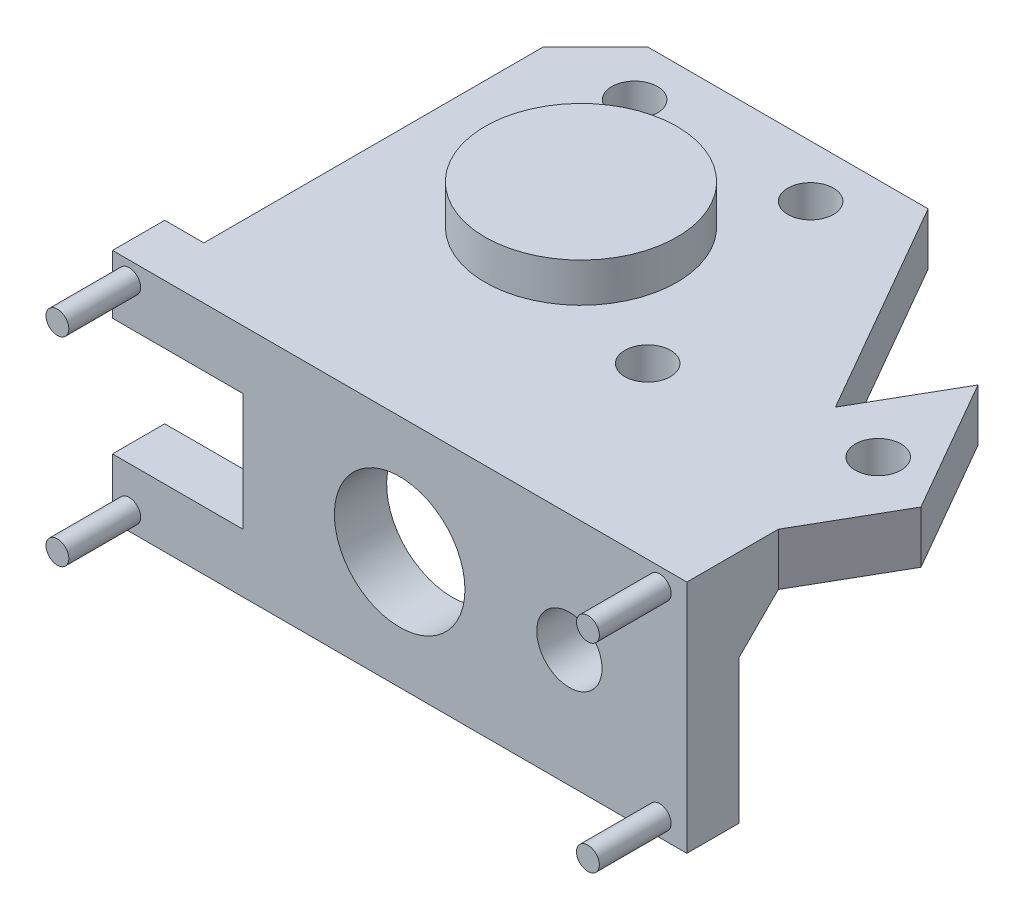
ISO-10303-21;
HEADER;
FILE_DESCRIPTION(('STEP AP214'),'2;1');
FILE_NAME('part.step','',(''),(''),'','','');
FILE_SCHEMA(('AUTOMOTIVE_DESIGN { 1 0 10303 214 1 1 1 1 }'));
ENDSEC;
DATA;
#1=APPLICATION_CONTEXT('core data for automotive mechanical design processes');
#2=APPLICATION_PROTOCOL_DEFINITION('international standard','automotive_design',2000,#1);
#3=PRODUCT_CONTEXT('',#1,'mechanical');
#4=PRODUCT('Part','Part','',(#3));
#5=PRODUCT_RELATED_PRODUCT_CATEGORY('part','',(#4));
#6=PRODUCT_DEFINITION_FORMATION('','',#4);
#7=PRODUCT_DEFINITION_CONTEXT('part definition',#1,'design');
#8=PRODUCT_DEFINITION('design','',#6,#7);
#9=PRODUCT_DEFINITION_SHAPE('','',#8);
#10=(LENGTH_UNIT() NAMED_UNIT(*) SI_UNIT(.MILLI.,.METRE.));
#11=(NAMED_UNIT(*) PLANE_ANGLE_UNIT() SI_UNIT($,.RADIAN.));
#12=(NAMED_UNIT(*) SI_UNIT($,.STERADIAN.) SOLID_ANGLE_UNIT());
#13=UNCERTAINTY_MEASURE_WITH_UNIT(LENGTH_MEASURE(1.E-05),#10,'distance_accuracy_value','');
#14=(GEOMETRIC_REPRESENTATION_CONTEXT(3) GLOBAL_UNCERTAINTY_ASSIGNED_CONTEXT((#13)) GLOBAL_UNIT_ASSIGNED_CONTEXT((#10,
#11,#12)) REPRESENTATION_CONTEXT('',''));
#15=CARTESIAN_POINT('',(0.,0.,0.));
#16=DIRECTION('',(0.,0.,1.));
#17=DIRECTION('',(1.,0.,0.));
#18=AXIS2_PLACEMENT_3D('',#15,#16,#17);
#19=CARTESIAN_POINT('',(0.,0.,0.));
#20=DIRECTION('',(0.,0.,1.));
#21=DIRECTION('',(1.,0.,0.));
#22=AXIS2_PLACEMENT_3D('',#19,#20,#21);
#23=PLANE('',#22);
#24=DIRECTION('',(0.,-1.,0.));
#25=VECTOR('',#24,1.);
#26=CARTESIAN_POINT('',(-19.,0.,0.));
#27=LINE('',#26,#25);
#28=CARTESIAN_POINT('',(-19.,9.,0.));
#29=VERTEX_POINT('',#28);
#30=CARTESIAN_POINT('',(-19.,4.5,0.));
#31=VERTEX_POINT('',#30);
#32=EDGE_CURVE('E235',#29,#31,#27,.T.);
#33=ORIENTED_EDGE('',*,*,#32,.T.);
#34=DIRECTION('',(1.,0.,0.));
#35=VECTOR('',#34,1.);
#36=CARTESIAN_POINT('',(0.,4.5,0.));
#37=LINE('',#36,#35);
#38=CARTESIAN_POINT('',(-22.,4.5,0.));
#39=VERTEX_POINT('',#38);
#40=EDGE_CURVE('E269',#39,#31,#37,.T.);
#41=ORIENTED_EDGE('',*,*,#40,.F.);
#42=DIRECTION('',(0.,-1.,0.));
#43=VECTOR('',#42,1.);
#44=CARTESIAN_POINT('',(-22.,9.,0.));
#45=LINE('',#44,#43);
#46=CARTESIAN_POINT('',(-22.,9.,0.));
#47=VERTEX_POINT('',#46);
#48=EDGE_CURVE('E336',#47,#39,#45,.T.);
#49=ORIENTED_EDGE('',*,*,#48,.F.);
#50=DIRECTION('',(-1.,0.,0.));
#51=VECTOR('',#50,1.);
#52=CARTESIAN_POINT('',(-22.,9.,0.));
#53=LINE('',#52,#51);
#54=EDGE_CURVE('E316',#29,#47,#53,.T.);
#55=ORIENTED_EDGE('',*,*,#54,.F.);
#56=EDGE_LOOP('',(#33,#41,#49,#55));
#57=FACE_BOUND('',#56,.T.);
#58=ADVANCED_FACE('F37',(#57),#23,.F.);
#59=CARTESIAN_POINT('',(17.8339229478491,12.,-10.2550012653063));
#60=DIRECTION('',(0.866895893185841,0.,-0.498489227945322));
#61=DIRECTION('',(-0.498489227945322,0.,-0.866895893185841));
#62=AXIS2_PLACEMENT_3D('',#59,#60,#61);
#63=PLANE('',#62);
#64=DIRECTION('',(0.498489227945322,0.,0.866895893185841));
#65=VECTOR('',#64,1.);
#66=CARTESIAN_POINT('',(14.0956627775563,9.,-16.7560091258864));
#67=LINE('',#66,#65);
#68=CARTESIAN_POINT('',(6.48,9.,-30.));
#69=VERTEX_POINT('',#68);
#70=CARTESIAN_POINT('',(16.0879177565685,9.,-13.2913852931841));
#71=VERTEX_POINT('',#70);
#72=EDGE_CURVE('E413',#69,#71,#67,.T.);
#73=ORIENTED_EDGE('',*,*,#72,.T.);
#74=DIRECTION('',(0.,-1.,0.));
#75=VECTOR('',#74,1.);
#76=CARTESIAN_POINT('',(16.0879177565685,9.,-13.2913852931841));
#77=LINE('',#76,#75);
#78=CARTESIAN_POINT('',(16.0879177565685,5.,-13.2913852931841));
#79=VERTEX_POINT('',#78);
#80=EDGE_CURVE('E390',#71,#79,#77,.T.);
#81=ORIENTED_EDGE('',*,*,#80,.T.);
#82=DIRECTION('',(0.498489227945322,0.,0.866895893185841));
#83=VECTOR('',#82,1.);
#84=CARTESIAN_POINT('',(17.8339229478491,5.,-10.2550012653063));
#85=LINE('',#84,#83);
#86=CARTESIAN_POINT('',(6.48,5.,-30.));
#87=VERTEX_POINT('',#86);
#88=EDGE_CURVE('E394',#87,#79,#85,.T.);
#89=ORIENTED_EDGE('',*,*,#88,.F.);
#90=DIRECTION('',(0.,-1.,0.));
#91=VECTOR('',#90,1.);
#92=CARTESIAN_POINT('',(6.47999999999999,0.,-30.));
#93=LINE('',#92,#91);
#94=EDGE_CURVE('E381',#69,#87,#93,.T.);
#95=ORIENTED_EDGE('',*,*,#94,.F.);
#96=EDGE_LOOP('',(#73,#81,#89,#95));
#97=FACE_BOUND('',#96,.T.);
#98=ADVANCED_FACE('F455',(#97),#63,.T.);
#99=CARTESIAN_POINT('',(22.,9.,4.));
#100=DIRECTION('',(-1.,0.,0.));
#101=DIRECTION('',(0.,0.,1.));
#102=AXIS2_PLACEMENT_3D('',#99,#100,#101);
#103=PLANE('',#102);
#104=DIRECTION('',(0.,-1.,0.));
#105=VECTOR('',#104,1.);
#106=CARTESIAN_POINT('',(22.,12.,-3.01));
#107=LINE('',#106,#105);
#108=CARTESIAN_POINT('',(22.,9.,-3.01));
#109=VERTEX_POINT('',#108);
#110=CARTESIAN_POINT('',(22.,5.,-3.01));
#111=VERTEX_POINT('',#110);
#112=EDGE_CURVE('E408',#109,#111,#107,.T.);
#113=ORIENTED_EDGE('',*,*,#112,.F.);
#114=DIRECTION('',(0.,0.,-1.));
#115=VECTOR('',#114,1.);
#116=CARTESIAN_POINT('',(22.,9.,4.));
#117=LINE('',#116,#115);
#118=CARTESIAN_POINT('',(22.,9.,4.));
#119=VERTEX_POINT('',#118);
#120=EDGE_CURVE('E325',#119,#109,#117,.T.);
#121=ORIENTED_EDGE('',*,*,#120,.F.);
#122=DIRECTION('',(0.,1.,0.));
#123=VECTOR('',#122,1.);
#124=CARTESIAN_POINT('',(22.,9.,4.));
#125=LINE('',#124,#123);
#126=CARTESIAN_POINT('',(22.,-9.,4.));
#127=VERTEX_POINT('',#126);
#128=EDGE_CURVE('E298',#127,#119,#125,.T.);
#129=ORIENTED_EDGE('',*,*,#128,.F.);
#130=DIRECTION('',(0.,0.,-1.));
#131=VECTOR('',#130,1.);
#132=CARTESIAN_POINT('',(22.,-9.,4.));
#133=LINE('',#132,#131);
#134=CARTESIAN_POINT('',(22.,-9.,0.));
#135=VERTEX_POINT('',#134);
#136=EDGE_CURVE('E310',#127,#135,#133,.T.);
#137=ORIENTED_EDGE('',*,*,#136,.T.);
#138=DIRECTION('',(0.,1.,0.));
#139=VECTOR('',#138,1.);
#140=CARTESIAN_POINT('',(22.,9.,0.));
#141=LINE('',#140,#139);
#142=CARTESIAN_POINT('',(22.,2.00000000000001,0.));
#143=VERTEX_POINT('',#142);
#144=EDGE_CURVE('E296',#135,#143,#141,.T.);
#145=ORIENTED_EDGE('',*,*,#144,.T.);
#146=DIRECTION('',(0.,-0.707106781186544,0.707106781186551));
#147=VECTOR('',#146,1.);
#148=CARTESIAN_POINT('',(22.,3.49999999999997,-1.49999999999998));
#149=LINE('',#148,#147);
#150=CARTESIAN_POINT('',(22.,5.,-3.00000000000002));
#151=VERTEX_POINT('',#150);
#152=EDGE_CURVE('E199',#143,#151,#149,.F.);
#153=ORIENTED_EDGE('',*,*,#152,.T.);
#154=DIRECTION('',(0.,0.,1.));
#155=VECTOR('',#154,1.);
#156=CARTESIAN_POINT('',(22.,5.,-30.));
#157=LINE('',#156,#155);
#158=EDGE_CURVE('E247',#111,#151,#157,.T.);
#159=ORIENTED_EDGE('',*,*,#158,.F.);
#160=EDGE_LOOP('',(#113,#121,#129,#137,#145,#153,#159));
#161=FACE_BOUND('',#160,.T.);
#162=ADVANCED_FACE('F353',(#161),#103,.F.);
#163=CARTESIAN_POINT('',(-22.,9.,4.));
#164=DIRECTION('',(0.,-1.,0.));
#165=DIRECTION('',(0.,0.,-1.));
#166=AXIS2_PLACEMENT_3D('',#163,#164,#165);
#167=PLANE('',#166);
#168=CARTESIAN_POINT('',(-12.,9.,-26.));
#169=DIRECTION('',(0.,-1.,0.));
#170=DIRECTION('',(0.,0.,-1.));
#171=AXIS2_PLACEMENT_3D('',#168,#169,#170);
#172=CIRCLE('',#171,1.75);
#173=CARTESIAN_POINT('',(-12.,9.,-27.75));
#174=VERTEX_POINT('',#173);
#175=EDGE_CURVE('E838',#174,#174,#172,.T.);
#176=ORIENTED_EDGE('',*,*,#175,.T.);
#177=EDGE_LOOP('',(#176));
#178=FACE_BOUND('',#177,.T.);
#179=CARTESIAN_POINT('',(1.48,9.,-26.));
#180=DIRECTION('',(0.,-1.,0.));
#181=DIRECTION('',(0.,0.,-1.));
#182=AXIS2_PLACEMENT_3D('',#179,#180,#181);
#183=CIRCLE('',#182,1.75);
#184=CARTESIAN_POINT('',(1.48,9.,-27.75));
#185=VERTEX_POINT('',#184);
#186=EDGE_CURVE('E842',#185,#185,#183,.T.);
#187=ORIENTED_EDGE('',*,*,#186,.T.);
#188=EDGE_LOOP('',(#187));
#189=FACE_BOUND('',#188,.T.);
#190=CARTESIAN_POINT('',(21.0379157900655,9.,-11.6182762193354));
#191=DIRECTION('',(0.,-1.,0.));
#192=DIRECTION('',(0.,0.,-1.));
#193=AXIS2_PLACEMENT_3D('',#190,#191,#192);
#194=CIRCLE('',#193,1.75);
#195=CARTESIAN_POINT('',(21.0379157900655,9.,-13.3682762193354));
#196=VERTEX_POINT('',#195);
#197=EDGE_CURVE('E428',#196,#196,#194,.T.);
#198=ORIENTED_EDGE('',*,*,#197,.T.);
#199=EDGE_LOOP('',(#198));
#200=FACE_BOUND('',#199,.T.);
#201=CARTESIAN_POINT('',(6.,9.,-9.));
#202=DIRECTION('',(0.,-1.,0.));
#203=DIRECTION('',(0.,0.,-1.));
#204=AXIS2_PLACEMENT_3D('',#201,#202,#203);
#205=CIRCLE('',#204,1.75);
#206=CARTESIAN_POINT('',(6.,9.,-10.75));
#207=VERTEX_POINT('',#206);
#208=EDGE_CURVE('E417',#207,#207,#205,.T.);
#209=ORIENTED_EDGE('',*,*,#208,.T.);
#210=EDGE_LOOP('',(#209));
#211=FACE_BOUND('',#210,.T.);
#212=CARTESIAN_POINT('',(-5.61,9.,-15.5));
#213=DIRECTION('',(0.,-1.,0.));
#214=DIRECTION('',(0.,0.,-1.));
#215=AXIS2_PLACEMENT_3D('',#212,#213,#214);
#216=CIRCLE('',#215,7.35);
#217=CARTESIAN_POINT('',(-5.61,9.,-22.85));
#218=VERTEX_POINT('',#217);
#219=EDGE_CURVE('E240',#218,#218,#216,.F.);
#220=ORIENTED_EDGE('',*,*,#219,.F.);
#221=EDGE_LOOP('',(#220));
#222=FACE_BOUND('',#221,.T.);
#223=DIRECTION('',(1.,0.,0.));
#224=VECTOR('',#223,1.);
#225=CARTESIAN_POINT('',(0.,9.,-30.));
#226=LINE('',#225,#224);
#227=CARTESIAN_POINT('',(-15.,9.,-30.));
#228=VERTEX_POINT('',#227);
#229=EDGE_CURVE('E228',#228,#69,#226,.T.);
#230=ORIENTED_EDGE('',*,*,#229,.F.);
#231=DIRECTION('',(0.707106781186549,0.,-0.707106781186546));
#232=VECTOR('',#231,1.);
#233=CARTESIAN_POINT('',(-19.,9.,-26.));
#234=LINE('',#233,#232);
#235=CARTESIAN_POINT('',(-19.,9.,-26.));
#236=VERTEX_POINT('',#235);
#237=EDGE_CURVE('E11',#228,#236,#234,.F.);
#238=ORIENTED_EDGE('',*,*,#237,.T.);
#239=DIRECTION('',(0.,0.,1.));
#240=VECTOR('',#239,1.);
#241=CARTESIAN_POINT('',(-19.,9.,-30.));
#242=LINE('',#241,#240);
#243=EDGE_CURVE('E224',#236,#29,#242,.T.);
#244=ORIENTED_EDGE('',*,*,#243,.T.);
#245=ORIENTED_EDGE('',*,*,#54,.T.);
#246=DIRECTION('',(0.,0.,-1.));
#247=VECTOR('',#246,1.);
#248=CARTESIAN_POINT('',(-22.,9.,4.));
#249=LINE('',#248,#247);
#250=CARTESIAN_POINT('',(-22.,9.,4.));
#251=VERTEX_POINT('',#250);
#252=EDGE_CURVE('E328',#251,#47,#249,.T.);
#253=ORIENTED_EDGE('',*,*,#252,.F.);
#254=DIRECTION('',(-1.,0.,0.));
#255=VECTOR('',#254,1.);
#256=CARTESIAN_POINT('',(-22.,9.,4.));
#257=LINE('',#256,#255);
#258=EDGE_CURVE('E301',#119,#251,#257,.T.);
#259=ORIENTED_EDGE('',*,*,#258,.F.);
#260=ORIENTED_EDGE('',*,*,#120,.T.);
#261=DIRECTION('',(0.498489227945323,0.,-0.866895893185841));
#262=VECTOR('',#261,1.);
#263=CARTESIAN_POINT('',(15.2324505955399,9.,8.75908237283362));
#264=LINE('',#263,#262);
#265=CARTESIAN_POINT('',(25.9879138235626,9.,-9.94516714548672));
#266=VERTEX_POINT('',#265);
#267=EDGE_CURVE('E405',#109,#266,#264,.T.);
#268=ORIENTED_EDGE('',*,*,#267,.T.);
#269=DIRECTION('',(0.498489227945322,0.,0.866895893185841));
#270=VECTOR('',#269,1.);
#271=CARTESIAN_POINT('',(23.8278251364293,9.,-13.7016615827115));
#272=LINE('',#271,#270);
#273=CARTESIAN_POINT('',(20.0758315801311,9.,-20.2265524386708));
#274=VERTEX_POINT('',#273);
#275=EDGE_CURVE('E388',#274,#266,#272,.T.);
#276=ORIENTED_EDGE('',*,*,#275,.F.);
#277=DIRECTION('',(-0.498489227945322,0.,0.866895893185841));
#278=VECTOR('',#277,1.);
#279=CARTESIAN_POINT('',(6.34649060096974,9.,3.64940845228049));
#280=LINE('',#279,#278);
#281=EDGE_CURVE('E386',#274,#71,#280,.T.);
#282=ORIENTED_EDGE('',*,*,#281,.T.);
#283=ORIENTED_EDGE('',*,*,#72,.F.);
#284=EDGE_LOOP('',(#230,#238,#244,#245,#253,#259,#260,#268,#276,#282,#283));
#285=FACE_BOUND('',#284,.T.);
#286=ADVANCED_FACE('F437',(#178,#189,#200,#211,#222,#285),#167,.F.);
#287=CARTESIAN_POINT('',(0.,5.,-30.));
#288=DIRECTION('',(0.,1.,0.));
#289=DIRECTION('',(0.,0.,1.));
#290=AXIS2_PLACEMENT_3D('',#287,#288,#289);
#291=PLANE('',#290);
#292=CARTESIAN_POINT('',(-12.,5.,-26.));
#293=DIRECTION('',(0.,-1.,0.));
#294=DIRECTION('',(0.,0.,-1.));
#295=AXIS2_PLACEMENT_3D('',#292,#293,#294);
#296=CIRCLE('',#295,1.75);
#297=CARTESIAN_POINT('',(-12.,5.,-27.75));
#298=VERTEX_POINT('',#297);
#299=EDGE_CURVE('E193',#298,#298,#296,.T.);
#300=ORIENTED_EDGE('',*,*,#299,.F.);
#301=EDGE_LOOP('',(#300));
#302=FACE_BOUND('',#301,.T.);
#303=CARTESIAN_POINT('',(1.48,5.,-26.));
#304=DIRECTION('',(0.,-1.,0.));
#305=DIRECTION('',(0.,0.,-1.));
#306=AXIS2_PLACEMENT_3D('',#303,#304,#305);
#307=CIRCLE('',#306,1.75);
#308=CARTESIAN_POINT('',(1.48,5.,-27.75));
#309=VERTEX_POINT('',#308);
#310=EDGE_CURVE('E839',#309,#309,#307,.T.);
#311=ORIENTED_EDGE('',*,*,#310,.F.);
#312=EDGE_LOOP('',(#311));
#313=FACE_BOUND('',#312,.T.);
#314=CARTESIAN_POINT('',(21.0379157900655,5.,-11.6182762193354));
#315=DIRECTION('',(0.,-1.,0.));
#316=DIRECTION('',(0.,0.,-1.));
#317=AXIS2_PLACEMENT_3D('',#314,#315,#316);
#318=CIRCLE('',#317,1.75);
#319=CARTESIAN_POINT('',(21.0379157900655,5.,-13.3682762193354));
#320=VERTEX_POINT('',#319);
#321=EDGE_CURVE('E848',#320,#320,#318,.T.);
#322=ORIENTED_EDGE('',*,*,#321,.F.);
#323=EDGE_LOOP('',(#322));
#324=FACE_BOUND('',#323,.T.);
#325=CARTESIAN_POINT('',(6.,5.,-9.));
#326=DIRECTION('',(0.,-1.,0.));
#327=DIRECTION('',(0.,0.,-1.));
#328=AXIS2_PLACEMENT_3D('',#325,#326,#327);
#329=CIRCLE('',#328,1.75);
#330=CARTESIAN_POINT('',(6.,5.,-10.75));
#331=VERTEX_POINT('',#330);
#332=EDGE_CURVE('E423',#331,#331,#329,.T.);
#333=ORIENTED_EDGE('',*,*,#332,.F.);
#334=EDGE_LOOP('',(#333));
#335=FACE_BOUND('',#334,.T.);
#336=DIRECTION('',(0.,0.,1.));
#337=VECTOR('',#336,1.);
#338=CARTESIAN_POINT('',(-19.,5.,-30.));
#339=LINE('',#338,#337);
#340=CARTESIAN_POINT('',(-19.,5.,-26.));
#341=VERTEX_POINT('',#340);
#342=CARTESIAN_POINT('',(-19.,5.,-3.00000000000002));
#343=VERTEX_POINT('',#342);
#344=EDGE_CURVE('E227',#341,#343,#339,.T.);
#345=ORIENTED_EDGE('',*,*,#344,.F.);
#346=DIRECTION('',(-0.707106781186549,0.,0.707106781186546));
#347=VECTOR('',#346,1.);
#348=CARTESIAN_POINT('',(-19.,5.,-26.));
#349=LINE('',#348,#347);
#350=CARTESIAN_POINT('',(-15.,5.,-30.));
#351=VERTEX_POINT('',#350);
#352=EDGE_CURVE('E59',#341,#351,#349,.F.);
#353=ORIENTED_EDGE('',*,*,#352,.T.);
#354=DIRECTION('',(-1.,0.,0.));
#355=VECTOR('',#354,1.);
#356=CARTESIAN_POINT('',(0.,5.,-30.));
#357=LINE('',#356,#355);
#358=EDGE_CURVE('E238',#87,#351,#357,.T.);
#359=ORIENTED_EDGE('',*,*,#358,.F.);
#360=ORIENTED_EDGE('',*,*,#88,.T.);
#361=DIRECTION('',(-0.498489227945322,0.,0.866895893185841));
#362=VECTOR('',#361,1.);
#363=CARTESIAN_POINT('',(6.34649060096974,5.,3.64940845228049));
#364=LINE('',#363,#362);
#365=CARTESIAN_POINT('',(20.0758315801311,5.,-20.2265524386708));
#366=VERTEX_POINT('',#365);
#367=EDGE_CURVE('E415',#366,#79,#364,.T.);
#368=ORIENTED_EDGE('',*,*,#367,.F.);
#369=DIRECTION('',(0.498489227945322,0.,0.866895893185841));
#370=VECTOR('',#369,1.);
#371=CARTESIAN_POINT('',(23.8278251364293,5.,-13.7016615827115));
#372=LINE('',#371,#370);
#373=CARTESIAN_POINT('',(25.9879138235626,5.,-9.94516714548672));
#374=VERTEX_POINT('',#373);
#375=EDGE_CURVE('E416',#366,#374,#372,.T.);
#376=ORIENTED_EDGE('',*,*,#375,.T.);
#377=DIRECTION('',(0.498489227945323,0.,-0.866895893185841));
#378=VECTOR('',#377,1.);
#379=CARTESIAN_POINT('',(15.2324505955399,5.,8.75908237283362));
#380=LINE('',#379,#378);
#381=EDGE_CURVE('E389',#111,#374,#380,.T.);
#382=ORIENTED_EDGE('',*,*,#381,.F.);
#383=ORIENTED_EDGE('',*,*,#158,.T.);
#384=DIRECTION('',(-1.,0.,0.));
#385=VECTOR('',#384,1.);
#386=CARTESIAN_POINT('',(0.,5.,-3.00000000000002));
#387=LINE('',#386,#385);
#388=CARTESIAN_POINT('',(0.,5.,-3.00000000000002));
#389=VERTEX_POINT('',#388);
#390=EDGE_CURVE('E204',#151,#389,#387,.T.);
#391=ORIENTED_EDGE('',*,*,#390,.T.);
#392=DIRECTION('',(-1.,0.,0.));
#393=VECTOR('',#392,1.);
#394=CARTESIAN_POINT('',(-19.,5.,-3.00000000000002));
#395=LINE('',#394,#393);
#396=EDGE_CURVE('E200',#389,#343,#395,.T.);
#397=ORIENTED_EDGE('',*,*,#396,.T.);
#398=EDGE_LOOP('',(#345,#353,#359,#360,#368,#376,#382,#383,#391,#397));
#399=FACE_BOUND('',#398,.T.);
#400=ADVANCED_FACE('F454',(#302,#313,#324,#335,#399),#291,.F.);
#401=CARTESIAN_POINT('',(0.,0.,-30.));
#402=DIRECTION('',(0.,0.,-1.));
#403=DIRECTION('',(-1.,0.,0.));
#404=AXIS2_PLACEMENT_3D('',#401,#402,#403);
#405=PLANE('',#404);
#406=ORIENTED_EDGE('',*,*,#358,.T.);
#407=DIRECTION('',(0.,1.,0.));
#408=VECTOR('',#407,1.);
#409=CARTESIAN_POINT('',(-15.,0.,-30.));
#410=LINE('',#409,#408);
#411=EDGE_CURVE('E45',#351,#228,#410,.T.);
#412=ORIENTED_EDGE('',*,*,#411,.T.);
#413=ORIENTED_EDGE('',*,*,#229,.T.);
#414=ORIENTED_EDGE('',*,*,#94,.T.);
#415=EDGE_LOOP('',(#406,#412,#413,#414));
#416=FACE_BOUND('',#415,.T.);
#417=ADVANCED_FACE('F456',(#416),#405,.T.);
#418=CARTESIAN_POINT('',(-22.,9.,4.));
#419=DIRECTION('',(1.,0.,0.));
#420=DIRECTION('',(0.,0.,-1.));
#421=AXIS2_PLACEMENT_3D('',#418,#419,#420);
#422=PLANE('',#421);
#423=DIRECTION('',(0.,0.,1.));
#424=VECTOR('',#423,1.);
#425=CARTESIAN_POINT('',(-22.,4.5,0.));
#426=LINE('',#425,#424);
#427=CARTESIAN_POINT('',(-22.,4.5,4.));
#428=VERTEX_POINT('',#427);
#429=EDGE_CURVE('E289',#39,#428,#426,.T.);
#430=ORIENTED_EDGE('',*,*,#429,.T.);
#431=DIRECTION('',(0.,-1.,0.));
#432=VECTOR('',#431,1.);
#433=CARTESIAN_POINT('',(-22.,9.,4.));
#434=LINE('',#433,#432);
#435=EDGE_CURVE('E305',#251,#428,#434,.T.);
#436=ORIENTED_EDGE('',*,*,#435,.F.);
#437=ORIENTED_EDGE('',*,*,#252,.T.);
#438=ORIENTED_EDGE('',*,*,#48,.T.);
#439=EDGE_LOOP('',(#430,#436,#437,#438));
#440=FACE_BOUND('',#439,.T.);
#441=ADVANCED_FACE('F472',(#440),#422,.F.);
#442=CARTESIAN_POINT('',(0.,0.,4.));
#443=DIRECTION('',(0.,0.,1.));
#444=DIRECTION('',(1.,0.,0.));
#445=AXIS2_PLACEMENT_3D('',#442,#443,#444);
#446=PLANE('',#445);
#447=CARTESIAN_POINT('',(13.,0.,4.));
#448=DIRECTION('',(0.,0.,1.));
#449=DIRECTION('',(1.,0.,0.));
#450=AXIS2_PLACEMENT_3D('',#447,#448,#449);
#451=CIRCLE('',#450,2.5);
#452=CARTESIAN_POINT('',(15.5,0.,4.));
#453=VERTEX_POINT('',#452);
#454=EDGE_CURVE('E194',#453,#453,#451,.T.);
#455=ORIENTED_EDGE('',*,*,#454,.F.);
#456=EDGE_LOOP('',(#455));
#457=FACE_BOUND('',#456,.T.);
#458=CARTESIAN_POINT('',(19.92,7.62,4.));
#459=DIRECTION('',(0.,0.,1.));
#460=DIRECTION('',(1.,0.,0.));
#461=AXIS2_PLACEMENT_3D('',#458,#459,#460);
#462=CIRCLE('',#461,0.875000000000002);
#463=CARTESIAN_POINT('',(20.795,7.62,4.));
#464=VERTEX_POINT('',#463);
#465=EDGE_CURVE('E319',#464,#464,#462,.T.);
#466=ORIENTED_EDGE('',*,*,#465,.F.);
#467=EDGE_LOOP('',(#466));
#468=FACE_BOUND('',#467,.T.);
#469=CARTESIAN_POINT('',(19.92,-7.62,4.));
#470=DIRECTION('',(0.,0.,1.));
#471=DIRECTION('',(1.,0.,0.));
#472=AXIS2_PLACEMENT_3D('',#469,#470,#471);
#473=CIRCLE('',#472,0.875000000000002);
#474=CARTESIAN_POINT('',(20.795,-7.62,4.));
#475=VERTEX_POINT('',#474);
#476=EDGE_CURVE('E251',#475,#475,#473,.T.);
#477=ORIENTED_EDGE('',*,*,#476,.F.);
#478=EDGE_LOOP('',(#477));
#479=FACE_BOUND('',#478,.T.);
#480=CARTESIAN_POINT('',(-20.72,-7.62,4.));
#481=DIRECTION('',(0.,0.,1.));
#482=DIRECTION('',(1.,0.,0.));
#483=AXIS2_PLACEMENT_3D('',#480,#481,#482);
#484=CIRCLE('',#483,0.875000000000002);
#485=CARTESIAN_POINT('',(-19.845,-7.62,4.));
#486=VERTEX_POINT('',#485);
#487=EDGE_CURVE('E322',#486,#486,#484,.T.);
#488=ORIENTED_EDGE('',*,*,#487,.F.);
#489=EDGE_LOOP('',(#488));
#490=FACE_BOUND('',#489,.T.);
#491=CARTESIAN_POINT('',(-20.72,7.62,4.));
#492=DIRECTION('',(0.,0.,1.));
#493=DIRECTION('',(1.,0.,0.));
#494=AXIS2_PLACEMENT_3D('',#491,#492,#493);
#495=CIRCLE('',#494,0.875000000000002);
#496=CARTESIAN_POINT('',(-19.845,7.62,4.));
#497=VERTEX_POINT('',#496);
#498=EDGE_CURVE('E260',#497,#497,#495,.T.);
#499=ORIENTED_EDGE('',*,*,#498,.F.);
#500=EDGE_LOOP('',(#499));
#501=FACE_BOUND('',#500,.T.);
#502=DIRECTION('',(1.,0.,0.));
#503=VECTOR('',#502,1.);
#504=CARTESIAN_POINT('',(0.,-4.5,4.));
#505=LINE('',#504,#503);
#506=CARTESIAN_POINT('',(-22.,-4.5,4.));
#507=VERTEX_POINT('',#506);
#508=CARTESIAN_POINT('',(-12.,-4.5,4.));
#509=VERTEX_POINT('',#508);
#510=EDGE_CURVE('E270',#507,#509,#505,.T.);
#511=ORIENTED_EDGE('',*,*,#510,.F.);
#512=CARTESIAN_POINT('',(-22.,-9.,4.));
#513=VERTEX_POINT('',#512);
#514=EDGE_CURVE('E304',#507,#513,#434,.T.);
#515=ORIENTED_EDGE('',*,*,#514,.T.);
#516=DIRECTION('',(1.,0.,0.));
#517=VECTOR('',#516,1.);
#518=CARTESIAN_POINT('',(-22.,-9.,4.));
#519=LINE('',#518,#517);
#520=EDGE_CURVE('E308',#513,#127,#519,.T.);
#521=ORIENTED_EDGE('',*,*,#520,.T.);
#522=ORIENTED_EDGE('',*,*,#128,.T.);
#523=ORIENTED_EDGE('',*,*,#258,.T.);
#524=ORIENTED_EDGE('',*,*,#435,.T.);
#525=DIRECTION('',(1.,0.,0.));
#526=VECTOR('',#525,1.);
#527=CARTESIAN_POINT('',(0.,4.5,4.));
#528=LINE('',#527,#526);
#529=CARTESIAN_POINT('',(-12.,4.5,4.));
#530=VERTEX_POINT('',#529);
#531=EDGE_CURVE('E279',#428,#530,#528,.T.);
#532=ORIENTED_EDGE('',*,*,#531,.T.);
#533=DIRECTION('',(0.,-1.,0.));
#534=VECTOR('',#533,1.);
#535=CARTESIAN_POINT('',(-12.,0.,4.));
#536=LINE('',#535,#534);
#537=EDGE_CURVE('E264',#530,#509,#536,.T.);
#538=ORIENTED_EDGE('',*,*,#537,.T.);
#539=EDGE_LOOP('',(#511,#515,#521,#522,#523,#524,#532,#538));
#540=FACE_BOUND('',#539,.T.);
#541=CARTESIAN_POINT('',(0.,0.,4.));
#542=DIRECTION('',(0.,0.,1.));
#543=DIRECTION('',(1.,0.,0.));
#544=AXIS2_PLACEMENT_3D('',#541,#542,#543);
#545=CIRCLE('',#544,5.);
#546=CARTESIAN_POINT('',(5.,0.,4.));
#547=VERTEX_POINT('',#546);
#548=EDGE_CURVE('E293',#547,#547,#545,.T.);
#549=ORIENTED_EDGE('',*,*,#548,.F.);
#550=EDGE_LOOP('',(#549));
#551=FACE_BOUND('',#550,.T.);
#552=ADVANCED_FACE('F360',(#457,#468,#479,#490,#501,#540,#551),#446,.T.);
#553=DIRECTION('',(1.,0.,0.));
#554=VECTOR('',#553,1.);
#555=CARTESIAN_POINT('',(22.,2.00000000000001,0.));
#556=LINE('',#555,#554);
#557=CARTESIAN_POINT('',(4.58257569495584,2.00000000000001,0.));
#558=VERTEX_POINT('',#557);
#559=CARTESIAN_POINT('',(11.5,2.00000000000001,0.));
#560=VERTEX_POINT('',#559);
#561=EDGE_CURVE('E192',#558,#560,#556,.T.);
#562=ORIENTED_EDGE('',*,*,#561,.T.);
#563=CARTESIAN_POINT('',(13.,0.,0.));
#564=DIRECTION('',(0.,0.,1.));
#565=DIRECTION('',(1.,0.,0.));
#566=AXIS2_PLACEMENT_3D('',#563,#564,#565);
#567=CIRCLE('',#566,2.5);
#568=CARTESIAN_POINT('',(14.5,2.00000000000001,0.));
#569=VERTEX_POINT('',#568);
#570=EDGE_CURVE('E178',#560,#569,#567,.T.);
#571=ORIENTED_EDGE('',*,*,#570,.T.);
#572=EDGE_CURVE('E189',#569,#143,#556,.T.);
#573=ORIENTED_EDGE('',*,*,#572,.T.);
#574=ORIENTED_EDGE('',*,*,#144,.F.);
#575=DIRECTION('',(1.,0.,0.));
#576=VECTOR('',#575,1.);
#577=CARTESIAN_POINT('',(-22.,-9.,0.));
#578=LINE('',#577,#576);
#579=CARTESIAN_POINT('',(-22.,-9.,0.));
#580=VERTEX_POINT('',#579);
#581=EDGE_CURVE('E302',#580,#135,#578,.T.);
#582=ORIENTED_EDGE('',*,*,#581,.F.);
#583=CARTESIAN_POINT('',(-22.,-4.5,0.));
#584=VERTEX_POINT('',#583);
#585=EDGE_CURVE('E318',#584,#580,#45,.T.);
#586=ORIENTED_EDGE('',*,*,#585,.F.);
#587=DIRECTION('',(1.,0.,0.));
#588=VECTOR('',#587,1.);
#589=CARTESIAN_POINT('',(0.,-4.5,0.));
#590=LINE('',#589,#588);
#591=CARTESIAN_POINT('',(-12.,-4.5,0.));
#592=VERTEX_POINT('',#591);
#593=EDGE_CURVE('E273',#584,#592,#590,.T.);
#594=ORIENTED_EDGE('',*,*,#593,.T.);
#595=DIRECTION('',(0.,-1.,0.));
#596=VECTOR('',#595,1.);
#597=CARTESIAN_POINT('',(-12.,0.,0.));
#598=LINE('',#597,#596);
#599=CARTESIAN_POINT('',(-12.,2.00000000000001,0.));
#600=VERTEX_POINT('',#599);
#601=EDGE_CURVE('E267',#600,#592,#598,.T.);
#602=ORIENTED_EDGE('',*,*,#601,.F.);
#603=DIRECTION('',(1.,0.,0.));
#604=VECTOR('',#603,1.);
#605=CARTESIAN_POINT('',(0.,2.00000000000001,0.));
#606=LINE('',#605,#604);
#607=CARTESIAN_POINT('',(-4.58257569495583,2.00000000000001,0.));
#608=VERTEX_POINT('',#607);
#609=EDGE_CURVE('E202',#600,#608,#606,.T.);
#610=ORIENTED_EDGE('',*,*,#609,.T.);
#611=CARTESIAN_POINT('',(0.,0.,0.));
#612=DIRECTION('',(0.,0.,1.));
#613=DIRECTION('',(1.,0.,0.));
#614=AXIS2_PLACEMENT_3D('',#611,#612,#613);
#615=CIRCLE('',#614,5.);
#616=EDGE_CURVE('E286',#608,#558,#615,.T.);
#617=ORIENTED_EDGE('',*,*,#616,.T.);
#618=EDGE_LOOP('',(#562,#571,#573,#574,#582,#586,#594,#602,#610,#617));
#619=FACE_BOUND('',#618,.T.);
#620=ADVANCED_FACE('F187',(#619),#23,.F.);
#621=ORIENTED_EDGE('',*,*,#514,.F.);
#622=DIRECTION('',(0.,0.,1.));
#623=VECTOR('',#622,1.);
#624=CARTESIAN_POINT('',(-22.,-4.5,0.));
#625=LINE('',#624,#623);
#626=EDGE_CURVE('E287',#584,#507,#625,.T.);
#627=ORIENTED_EDGE('',*,*,#626,.F.);
#628=ORIENTED_EDGE('',*,*,#585,.T.);
#629=DIRECTION('',(0.,0.,-1.));
#630=VECTOR('',#629,1.);
#631=CARTESIAN_POINT('',(-22.,-9.,4.));
#632=LINE('',#631,#630);
#633=EDGE_CURVE('E331',#513,#580,#632,.T.);
#634=ORIENTED_EDGE('',*,*,#633,.F.);
#635=EDGE_LOOP('',(#621,#627,#628,#634));
#636=FACE_BOUND('',#635,.T.);
#637=ADVANCED_FACE('F345',(#636),#422,.F.);
#638=CARTESIAN_POINT('',(-22.,-9.,4.));
#639=DIRECTION('',(0.,1.,0.));
#640=DIRECTION('',(0.,0.,1.));
#641=AXIS2_PLACEMENT_3D('',#638,#639,#640);
#642=PLANE('',#641);
#643=ORIENTED_EDGE('',*,*,#581,.T.);
#644=ORIENTED_EDGE('',*,*,#136,.F.);
#645=ORIENTED_EDGE('',*,*,#520,.F.);
#646=ORIENTED_EDGE('',*,*,#633,.T.);
#647=EDGE_LOOP('',(#643,#644,#645,#646));
#648=FACE_BOUND('',#647,.T.);
#649=ADVANCED_FACE('F349',(#648),#642,.F.);
#650=CARTESIAN_POINT('',(0.,0.,4.));
#651=DIRECTION('',(0.,0.,-1.));
#652=DIRECTION('',(-1.,0.,0.));
#653=AXIS2_PLACEMENT_3D('',#650,#651,#652);
#654=CYLINDRICAL_SURFACE('',#653,5.);
#655=ORIENTED_EDGE('',*,*,#548,.T.);
#656=EDGE_LOOP('',(#655));
#657=FACE_BOUND('',#656,.T.);
#658=CARTESIAN_POINT('',(0.,0.,2.00000000000003));
#659=DIRECTION('',(0.,-0.707106781186551,-0.707106781186544));
#660=DIRECTION('',(0.,0.707106781186544,-0.707106781186551));
#661=AXIS2_PLACEMENT_3D('',#658,#659,#660);
#662=ELLIPSE('',#661,7.07106781186551,5.);
#663=EDGE_CURVE('E216',#608,#389,#662,.T.);
#664=ORIENTED_EDGE('',*,*,#663,.T.);
#665=CARTESIAN_POINT('',(0.,0.,2.00000000000003));
#666=DIRECTION('',(0.,-0.707106781186551,-0.707106781186544));
#667=DIRECTION('',(0.,0.707106781186544,-0.707106781186551));
#668=AXIS2_PLACEMENT_3D('',#665,#666,#667);
#669=ELLIPSE('',#668,7.07106781186551,5.);
#670=EDGE_CURVE('E219',#389,#558,#669,.T.);
#671=ORIENTED_EDGE('',*,*,#670,.T.);
#672=ORIENTED_EDGE('',*,*,#616,.F.);
#673=EDGE_LOOP('',(#664,#671,#672));
#674=FACE_BOUND('',#673,.T.);
#675=ADVANCED_FACE('F380',(#657,#674),#654,.F.);
#676=CARTESIAN_POINT('',(-12.,0.,0.));
#677=DIRECTION('',(-1.,0.,0.));
#678=DIRECTION('',(0.,-1.,0.));
#679=AXIS2_PLACEMENT_3D('',#676,#677,#678);
#680=PLANE('',#679);
#681=ORIENTED_EDGE('',*,*,#537,.F.);
#682=DIRECTION('',(0.,0.,1.));
#683=VECTOR('',#682,1.);
#684=CARTESIAN_POINT('',(-12.,4.5,0.));
#685=LINE('',#684,#683);
#686=CARTESIAN_POINT('',(-12.,4.5,-2.50000000000001));
#687=VERTEX_POINT('',#686);
#688=EDGE_CURVE('E276',#687,#530,#685,.T.);
#689=ORIENTED_EDGE('',*,*,#688,.F.);
#690=DIRECTION('',(0.,0.707106781186544,-0.707106781186551));
#691=VECTOR('',#690,1.);
#692=CARTESIAN_POINT('',(-12.,5.,-3.00000000000002));
#693=LINE('',#692,#691);
#694=EDGE_CURVE('E214',#687,#600,#693,.F.);
#695=ORIENTED_EDGE('',*,*,#694,.T.);
#696=ORIENTED_EDGE('',*,*,#601,.T.);
#697=DIRECTION('',(0.,0.,1.));
#698=VECTOR('',#697,1.);
#699=CARTESIAN_POINT('',(-12.,-4.5,0.));
#700=LINE('',#699,#698);
#701=EDGE_CURVE('E284',#592,#509,#700,.T.);
#702=ORIENTED_EDGE('',*,*,#701,.T.);
#703=EDGE_LOOP('',(#681,#689,#695,#696,#702));
#704=FACE_BOUND('',#703,.T.);
#705=ADVANCED_FACE('F657',(#704),#680,.T.);
#706=CARTESIAN_POINT('',(0.,-4.5,0.));
#707=DIRECTION('',(0.,-1.,0.));
#708=DIRECTION('',(0.,0.,-1.));
#709=AXIS2_PLACEMENT_3D('',#706,#707,#708);
#710=PLANE('',#709);
#711=ORIENTED_EDGE('',*,*,#510,.T.);
#712=ORIENTED_EDGE('',*,*,#701,.F.);
#713=ORIENTED_EDGE('',*,*,#593,.F.);
#714=ORIENTED_EDGE('',*,*,#626,.T.);
#715=EDGE_LOOP('',(#711,#712,#713,#714));
#716=FACE_BOUND('',#715,.T.);
#717=ADVANCED_FACE('F366',(#716),#710,.F.);
#718=CARTESIAN_POINT('',(0.,4.5,0.));
#719=DIRECTION('',(0.,-1.,0.));
#720=DIRECTION('',(0.,0.,-1.));
#721=AXIS2_PLACEMENT_3D('',#718,#719,#720);
#722=PLANE('',#721);
#723=ORIENTED_EDGE('',*,*,#531,.F.);
#724=ORIENTED_EDGE('',*,*,#429,.F.);
#725=ORIENTED_EDGE('',*,*,#40,.T.);
#726=DIRECTION('',(0.,0.,-1.));
#727=VECTOR('',#726,1.);
#728=CARTESIAN_POINT('',(-19.,4.5,0.));
#729=LINE('',#728,#727);
#730=CARTESIAN_POINT('',(-19.,4.5,-2.50000000000001));
#731=VERTEX_POINT('',#730);
#732=EDGE_CURVE('E184',#31,#731,#729,.T.);
#733=ORIENTED_EDGE('',*,*,#732,.T.);
#734=DIRECTION('',(-1.,0.,0.));
#735=VECTOR('',#734,1.);
#736=CARTESIAN_POINT('',(0.,4.5,-2.50000000000001));
#737=LINE('',#736,#735);
#738=EDGE_CURVE('E211',#731,#687,#737,.F.);
#739=ORIENTED_EDGE('',*,*,#738,.T.);
#740=ORIENTED_EDGE('',*,*,#688,.T.);
#741=EDGE_LOOP('',(#723,#724,#725,#733,#739,#740));
#742=FACE_BOUND('',#741,.T.);
#743=ADVANCED_FACE('F470',(#742),#722,.T.);
#744=CARTESIAN_POINT('',(-20.72,7.62,9.5));
#745=DIRECTION('',(0.,0.,-1.));
#746=DIRECTION('',(-1.,0.,0.));
#747=AXIS2_PLACEMENT_3D('',#744,#745,#746);
#748=CYLINDRICAL_SURFACE('',#747,0.875000000000002);
#749=CARTESIAN_POINT('',(-20.72,7.62,9.5));
#750=DIRECTION('',(0.,0.,1.));
#751=DIRECTION('',(1.,0.,0.));
#752=AXIS2_PLACEMENT_3D('',#749,#750,#751);
#753=CIRCLE('',#752,0.875000000000002);
#754=CARTESIAN_POINT('',(-19.845,7.62,9.5));
#755=VERTEX_POINT('',#754);
#756=EDGE_CURVE('E261',#755,#755,#753,.T.);
#757=ORIENTED_EDGE('',*,*,#756,.F.);
#758=EDGE_LOOP('',(#757));
#759=FACE_BOUND('',#758,.T.);
#760=ORIENTED_EDGE('',*,*,#498,.T.);
#761=EDGE_LOOP('',(#760));
#762=FACE_BOUND('',#761,.T.);
#763=ADVANCED_FACE('F673',(#759,#762),#748,.T.);
#764=CARTESIAN_POINT('',(0.,0.,9.5));
#765=DIRECTION('',(0.,0.,1.));
#766=DIRECTION('',(1.,0.,0.));
#767=AXIS2_PLACEMENT_3D('',#764,#765,#766);
#768=PLANE('',#767);
#769=ORIENTED_EDGE('',*,*,#756,.T.);
#770=EDGE_LOOP('',(#769));
#771=FACE_BOUND('',#770,.T.);
#772=ADVANCED_FACE('F692',(#771),#768,.T.);
#773=CARTESIAN_POINT('',(-20.72,-7.62,9.5));
#774=DIRECTION('',(0.,0.,-1.));
#775=DIRECTION('',(-1.,0.,0.));
#776=AXIS2_PLACEMENT_3D('',#773,#774,#775);
#777=CYLINDRICAL_SURFACE('',#776,0.875000000000002);
#778=CARTESIAN_POINT('',(-20.72,-7.62,9.5));
#779=DIRECTION('',(0.,0.,1.));
#780=DIRECTION('',(1.,0.,0.));
#781=AXIS2_PLACEMENT_3D('',#778,#779,#780);
#782=CIRCLE('',#781,0.875000000000002);
#783=CARTESIAN_POINT('',(-19.845,-7.62,9.5));
#784=VERTEX_POINT('',#783);
#785=EDGE_CURVE('E255',#784,#784,#782,.F.);
#786=ORIENTED_EDGE('',*,*,#785,.T.);
#787=EDGE_LOOP('',(#786));
#788=FACE_BOUND('',#787,.T.);
#789=ORIENTED_EDGE('',*,*,#487,.T.);
#790=EDGE_LOOP('',(#789));
#791=FACE_BOUND('',#790,.T.);
#792=ADVANCED_FACE('F699',(#788,#791),#777,.T.);
#793=CARTESIAN_POINT('',(0.,0.,9.5));
#794=DIRECTION('',(0.,0.,1.));
#795=DIRECTION('',(1.,0.,0.));
#796=AXIS2_PLACEMENT_3D('',#793,#794,#795);
#797=PLANE('',#796);
#798=ORIENTED_EDGE('',*,*,#785,.F.);
#799=EDGE_LOOP('',(#798));
#800=FACE_BOUND('',#799,.T.);
#801=ADVANCED_FACE('F707',(#800),#797,.T.);
#802=CARTESIAN_POINT('',(19.92,-7.62,9.5));
#803=DIRECTION('',(0.,0.,-1.));
#804=DIRECTION('',(-1.,0.,0.));
#805=AXIS2_PLACEMENT_3D('',#802,#803,#804);
#806=CYLINDRICAL_SURFACE('',#805,0.875000000000002);
#807=CARTESIAN_POINT('',(19.92,-7.62,9.5));
#808=DIRECTION('',(0.,0.,1.));
#809=DIRECTION('',(1.,0.,0.));
#810=AXIS2_PLACEMENT_3D('',#807,#808,#809);
#811=CIRCLE('',#810,0.875000000000002);
#812=CARTESIAN_POINT('',(20.795,-7.62,9.5));
#813=VERTEX_POINT('',#812);
#814=EDGE_CURVE('E252',#813,#813,#811,.T.);
#815=ORIENTED_EDGE('',*,*,#814,.F.);
#816=EDGE_LOOP('',(#815));
#817=FACE_BOUND('',#816,.T.);
#818=ORIENTED_EDGE('',*,*,#476,.T.);
#819=EDGE_LOOP('',(#818));
#820=FACE_BOUND('',#819,.T.);
#821=ADVANCED_FACE('F715',(#817,#820),#806,.T.);
#822=CARTESIAN_POINT('',(0.,0.,9.5));
#823=DIRECTION('',(0.,0.,1.));
#824=DIRECTION('',(1.,0.,0.));
#825=AXIS2_PLACEMENT_3D('',#822,#823,#824);
#826=PLANE('',#825);
#827=ORIENTED_EDGE('',*,*,#814,.T.);
#828=EDGE_LOOP('',(#827));
#829=FACE_BOUND('',#828,.T.);
#830=ADVANCED_FACE('F723',(#829),#826,.T.);
#831=CARTESIAN_POINT('',(19.92,7.62,9.5));
#832=DIRECTION('',(0.,0.,-1.));
#833=DIRECTION('',(-1.,0.,0.));
#834=AXIS2_PLACEMENT_3D('',#831,#832,#833);
#835=CYLINDRICAL_SURFACE('',#834,0.875000000000002);
#836=CARTESIAN_POINT('',(19.92,7.62,9.5));
#837=DIRECTION('',(0.,0.,1.));
#838=DIRECTION('',(1.,0.,0.));
#839=AXIS2_PLACEMENT_3D('',#836,#837,#838);
#840=CIRCLE('',#839,0.875000000000002);
#841=CARTESIAN_POINT('',(20.795,7.62,9.5));
#842=VERTEX_POINT('',#841);
#843=EDGE_CURVE('E248',#842,#842,#840,.F.);
#844=ORIENTED_EDGE('',*,*,#843,.T.);
#845=EDGE_LOOP('',(#844));
#846=FACE_BOUND('',#845,.T.);
#847=ORIENTED_EDGE('',*,*,#465,.T.);
#848=EDGE_LOOP('',(#847));
#849=FACE_BOUND('',#848,.T.);
#850=ADVANCED_FACE('F730',(#846,#849),#835,.T.);
#851=CARTESIAN_POINT('',(0.,0.,9.5));
#852=DIRECTION('',(0.,0.,1.));
#853=DIRECTION('',(1.,0.,0.));
#854=AXIS2_PLACEMENT_3D('',#851,#852,#853);
#855=PLANE('',#854);
#856=ORIENTED_EDGE('',*,*,#843,.F.);
#857=EDGE_LOOP('',(#856));
#858=FACE_BOUND('',#857,.T.);
#859=ADVANCED_FACE('F560',(#858),#855,.T.);
#860=CARTESIAN_POINT('',(-19.,0.,-30.));
#861=DIRECTION('',(-1.,0.,0.));
#862=DIRECTION('',(0.,0.,1.));
#863=AXIS2_PLACEMENT_3D('',#860,#861,#862);
#864=PLANE('',#863);
#865=ORIENTED_EDGE('',*,*,#243,.F.);
#866=DIRECTION('',(0.,-1.,0.));
#867=VECTOR('',#866,1.);
#868=CARTESIAN_POINT('',(-19.,0.,-26.));
#869=LINE('',#868,#867);
#870=EDGE_CURVE('E183',#236,#341,#869,.T.);
#871=ORIENTED_EDGE('',*,*,#870,.T.);
#872=ORIENTED_EDGE('',*,*,#344,.T.);
#873=DIRECTION('',(0.,0.707106781186544,-0.707106781186551));
#874=VECTOR('',#873,1.);
#875=CARTESIAN_POINT('',(-19.,5.,-3.00000000000002));
#876=LINE('',#875,#874);
#877=EDGE_CURVE('E209',#343,#731,#876,.F.);
#878=ORIENTED_EDGE('',*,*,#877,.T.);
#879=ORIENTED_EDGE('',*,*,#732,.F.);
#880=ORIENTED_EDGE('',*,*,#32,.F.);
#881=EDGE_LOOP('',(#865,#871,#872,#878,#879,#880));
#882=FACE_BOUND('',#881,.T.);
#883=ADVANCED_FACE('F463',(#882),#864,.T.);
#884=CARTESIAN_POINT('',(-5.61,12.,-15.5));
#885=DIRECTION('',(0.,-1.,0.));
#886=DIRECTION('',(0.,0.,-1.));
#887=AXIS2_PLACEMENT_3D('',#884,#885,#886);
#888=CYLINDRICAL_SURFACE('',#887,7.35);
#889=CARTESIAN_POINT('',(-5.61,12.,-15.5));
#890=DIRECTION('',(0.,1.,0.));
#891=DIRECTION('',(0.,0.,1.));
#892=AXIS2_PLACEMENT_3D('',#889,#890,#891);
#893=CIRCLE('',#892,7.35);
#894=CARTESIAN_POINT('',(-5.61,12.,-8.15));
#895=VERTEX_POINT('',#894);
#896=EDGE_CURVE('E239',#895,#895,#893,.T.);
#897=ORIENTED_EDGE('',*,*,#896,.F.);
#898=EDGE_LOOP('',(#897));
#899=FACE_BOUND('',#898,.T.);
#900=ORIENTED_EDGE('',*,*,#219,.T.);
#901=EDGE_LOOP('',(#900));
#902=FACE_BOUND('',#901,.T.);
#903=ADVANCED_FACE('F559',(#899,#902),#888,.T.);
#904=CARTESIAN_POINT('',(0.,12.,0.));
#905=DIRECTION('',(0.,1.,0.));
#906=DIRECTION('',(0.,0.,1.));
#907=AXIS2_PLACEMENT_3D('',#904,#905,#906);
#908=PLANE('',#907);
#909=ORIENTED_EDGE('',*,*,#896,.T.);
#910=EDGE_LOOP('',(#909));
#911=FACE_BOUND('',#910,.T.);
#912=ADVANCED_FACE('F575',(#911),#908,.T.);
#913=CARTESIAN_POINT('',(6.34649060096974,9.,3.64940845228049));
#914=DIRECTION('',(0.866895893185841,0.,0.498489227945322));
#915=DIRECTION('',(0.498489227945322,0.,-0.866895893185841));
#916=AXIS2_PLACEMENT_3D('',#913,#914,#915);
#917=PLANE('',#916);
#918=ORIENTED_EDGE('',*,*,#367,.T.);
#919=ORIENTED_EDGE('',*,*,#80,.F.);
#920=ORIENTED_EDGE('',*,*,#281,.F.);
#921=DIRECTION('',(0.,-1.,0.));
#922=VECTOR('',#921,1.);
#923=CARTESIAN_POINT('',(20.0758315801311,9.,-20.2265524386708));
#924=LINE('',#923,#922);
#925=EDGE_CURVE('E403',#274,#366,#924,.T.);
#926=ORIENTED_EDGE('',*,*,#925,.T.);
#927=EDGE_LOOP('',(#918,#919,#920,#926));
#928=FACE_BOUND('',#927,.T.);
#929=ADVANCED_FACE('F446',(#928),#917,.F.);
#930=CARTESIAN_POINT('',(15.2324505955399,9.,8.75908237283362));
#931=DIRECTION('',(-0.86689589318584,0.,-0.498489227945323));
#932=DIRECTION('',(-0.498489227945323,0.,0.866895893185841));
#933=AXIS2_PLACEMENT_3D('',#930,#931,#932);
#934=PLANE('',#933);
#935=ORIENTED_EDGE('',*,*,#381,.T.);
#936=DIRECTION('',(0.,-1.,0.));
#937=VECTOR('',#936,1.);
#938=CARTESIAN_POINT('',(25.9879138235626,9.,-9.94516714548672));
#939=LINE('',#938,#937);
#940=EDGE_CURVE('E395',#266,#374,#939,.T.);
#941=ORIENTED_EDGE('',*,*,#940,.F.);
#942=ORIENTED_EDGE('',*,*,#267,.F.);
#943=ORIENTED_EDGE('',*,*,#112,.T.);
#944=EDGE_LOOP('',(#935,#941,#942,#943));
#945=FACE_BOUND('',#944,.T.);
#946=ADVANCED_FACE('F440',(#945),#934,.F.);
#947=CARTESIAN_POINT('',(23.8278251364293,9.,-13.7016615827115));
#948=DIRECTION('',(0.866895893185841,0.,-0.498489227945322));
#949=DIRECTION('',(-0.498489227945322,0.,-0.866895893185841));
#950=AXIS2_PLACEMENT_3D('',#947,#948,#949);
#951=PLANE('',#950);
#952=ORIENTED_EDGE('',*,*,#375,.F.);
#953=ORIENTED_EDGE('',*,*,#925,.F.);
#954=ORIENTED_EDGE('',*,*,#275,.T.);
#955=ORIENTED_EDGE('',*,*,#940,.T.);
#956=EDGE_LOOP('',(#952,#953,#954,#955));
#957=FACE_BOUND('',#956,.T.);
#958=ADVANCED_FACE('F444',(#957),#951,.T.);
#959=CARTESIAN_POINT('',(6.,12.,-9.));
#960=DIRECTION('',(0.,-1.,0.));
#961=DIRECTION('',(0.,0.,-1.));
#962=AXIS2_PLACEMENT_3D('',#959,#960,#961);
#963=CYLINDRICAL_SURFACE('',#962,1.75);
#964=ORIENTED_EDGE('',*,*,#332,.T.);
#965=EDGE_LOOP('',(#964));
#966=FACE_BOUND('',#965,.T.);
#967=ORIENTED_EDGE('',*,*,#208,.F.);
#968=EDGE_LOOP('',(#967));
#969=FACE_BOUND('',#968,.T.);
#970=ADVANCED_FACE('F602',(#966,#969),#963,.F.);
#971=CARTESIAN_POINT('',(21.0379157900655,12.,-11.6182762193354));
#972=DIRECTION('',(0.,-1.,0.));
#973=DIRECTION('',(0.,0.,-1.));
#974=AXIS2_PLACEMENT_3D('',#971,#972,#973);
#975=CYLINDRICAL_SURFACE('',#974,1.75);
#976=ORIENTED_EDGE('',*,*,#321,.T.);
#977=EDGE_LOOP('',(#976));
#978=FACE_BOUND('',#977,.T.);
#979=ORIENTED_EDGE('',*,*,#197,.F.);
#980=EDGE_LOOP('',(#979));
#981=FACE_BOUND('',#980,.T.);
#982=ADVANCED_FACE('F609',(#978,#981),#975,.F.);
#983=CARTESIAN_POINT('',(1.48,12.,-26.));
#984=DIRECTION('',(0.,-1.,0.));
#985=DIRECTION('',(0.,0.,-1.));
#986=AXIS2_PLACEMENT_3D('',#983,#984,#985);
#987=CYLINDRICAL_SURFACE('',#986,1.75);
#988=ORIENTED_EDGE('',*,*,#310,.T.);
#989=EDGE_LOOP('',(#988));
#990=FACE_BOUND('',#989,.T.);
#991=ORIENTED_EDGE('',*,*,#186,.F.);
#992=EDGE_LOOP('',(#991));
#993=FACE_BOUND('',#992,.T.);
#994=ADVANCED_FACE('F617',(#990,#993),#987,.F.);
#995=CARTESIAN_POINT('',(-12.,12.,-26.));
#996=DIRECTION('',(0.,-1.,0.));
#997=DIRECTION('',(0.,0.,-1.));
#998=AXIS2_PLACEMENT_3D('',#995,#996,#997);
#999=CYLINDRICAL_SURFACE('',#998,1.75);
#1000=ORIENTED_EDGE('',*,*,#299,.T.);
#1001=EDGE_LOOP('',(#1000));
#1002=FACE_BOUND('',#1001,.T.);
#1003=ORIENTED_EDGE('',*,*,#175,.F.);
#1004=EDGE_LOOP('',(#1003));
#1005=FACE_BOUND('',#1004,.T.);
#1006=ADVANCED_FACE('F508',(#1002,#1005),#999,.F.);
#1007=CARTESIAN_POINT('',(0.,5.,-3.00000000000002));
#1008=DIRECTION('',(0.,-0.707106781186551,-0.707106781186544));
#1009=DIRECTION('',(1.,0.,0.));
#1010=AXIS2_PLACEMENT_3D('',#1007,#1008,#1009);
#1011=PLANE('',#1010);
#1012=ORIENTED_EDGE('',*,*,#572,.F.);
#1013=CARTESIAN_POINT('',(13.,0.,2.00000000000003));
#1014=DIRECTION('',(0.,-0.707106781186551,-0.707106781186544));
#1015=DIRECTION('',(0.,-0.707106781186544,0.707106781186551));
#1016=AXIS2_PLACEMENT_3D('',#1013,#1014,#1015);
#1017=ELLIPSE('',#1016,3.53553390593275,2.5);
#1018=EDGE_CURVE('E175',#569,#560,#1017,.F.);
#1019=ORIENTED_EDGE('',*,*,#1018,.T.);
#1020=ORIENTED_EDGE('',*,*,#561,.F.);
#1021=ORIENTED_EDGE('',*,*,#670,.F.);
#1022=ORIENTED_EDGE('',*,*,#390,.F.);
#1023=ORIENTED_EDGE('',*,*,#152,.F.);
#1024=EDGE_LOOP('',(#1012,#1019,#1020,#1021,#1022,#1023));
#1025=FACE_BOUND('',#1024,.T.);
#1026=ADVANCED_FACE('F197',(#1025),#1011,.T.);
#1027=CARTESIAN_POINT('',(0.,5.,-3.00000000000002));
#1028=DIRECTION('',(0.,-0.707106781186551,-0.707106781186544));
#1029=DIRECTION('',(1.,0.,0.));
#1030=AXIS2_PLACEMENT_3D('',#1027,#1028,#1029);
#1031=PLANE('',#1030);
#1032=ORIENTED_EDGE('',*,*,#694,.F.);
#1033=ORIENTED_EDGE('',*,*,#738,.F.);
#1034=ORIENTED_EDGE('',*,*,#877,.F.);
#1035=ORIENTED_EDGE('',*,*,#396,.F.);
#1036=ORIENTED_EDGE('',*,*,#663,.F.);
#1037=ORIENTED_EDGE('',*,*,#609,.F.);
#1038=EDGE_LOOP('',(#1032,#1033,#1034,#1035,#1036,#1037));
#1039=FACE_BOUND('',#1038,.T.);
#1040=ADVANCED_FACE('F374',(#1039),#1031,.T.);
#1041=CARTESIAN_POINT('',(13.,0.,-30.000025));
#1042=DIRECTION('',(0.,0.,1.));
#1043=DIRECTION('',(1.,0.,0.));
#1044=AXIS2_PLACEMENT_3D('',#1041,#1042,#1043);
#1045=CYLINDRICAL_SURFACE('',#1044,2.5);
#1046=ORIENTED_EDGE('',*,*,#454,.T.);
#1047=EDGE_LOOP('',(#1046));
#1048=FACE_BOUND('',#1047,.T.);
#1049=ORIENTED_EDGE('',*,*,#1018,.F.);
#1050=ORIENTED_EDGE('',*,*,#570,.F.);
#1051=EDGE_LOOP('',(#1049,#1050));
#1052=FACE_BOUND('',#1051,.T.);
#1053=ADVANCED_FACE('F177',(#1048,#1052),#1045,.F.);
#1054=CARTESIAN_POINT('',(-19.,0.,-26.));
#1055=DIRECTION('',(0.707106781186546,0.,0.707106781186549));
#1056=DIRECTION('',(0.,-1.,0.));
#1057=AXIS2_PLACEMENT_3D('',#1054,#1055,#1056);
#1058=PLANE('',#1057);
#1059=ORIENTED_EDGE('',*,*,#237,.F.);
#1060=ORIENTED_EDGE('',*,*,#411,.F.);
#1061=ORIENTED_EDGE('',*,*,#352,.F.);
#1062=ORIENTED_EDGE('',*,*,#870,.F.);
#1063=EDGE_LOOP('',(#1059,#1060,#1061,#1062));
#1064=FACE_BOUND('',#1063,.T.);
#1065=ADVANCED_FACE('F39',(#1064),#1058,.F.);
#1066=CLOSED_SHELL('',(#58,#98,#162,#286,#400,#417,#441,#552,#620,#637,#649,#675,#705,#717,#743,
#763,#772,#792,#801,#821,#830,#850,#859,#883,#903,#912,#929,#946,#958,#970,#982,#994,#1006,
#1026,#1040,#1053,#1065));
#1067=MANIFOLD_SOLID_BREP('B2',#1066);
#1068=ADVANCED_BREP_SHAPE_REPRESENTATION('',(#18,#1067),#14);
#1069=SHAPE_DEFINITION_REPRESENTATION(#9,#1068);
ENDSEC;
END-ISO-10303-21;
